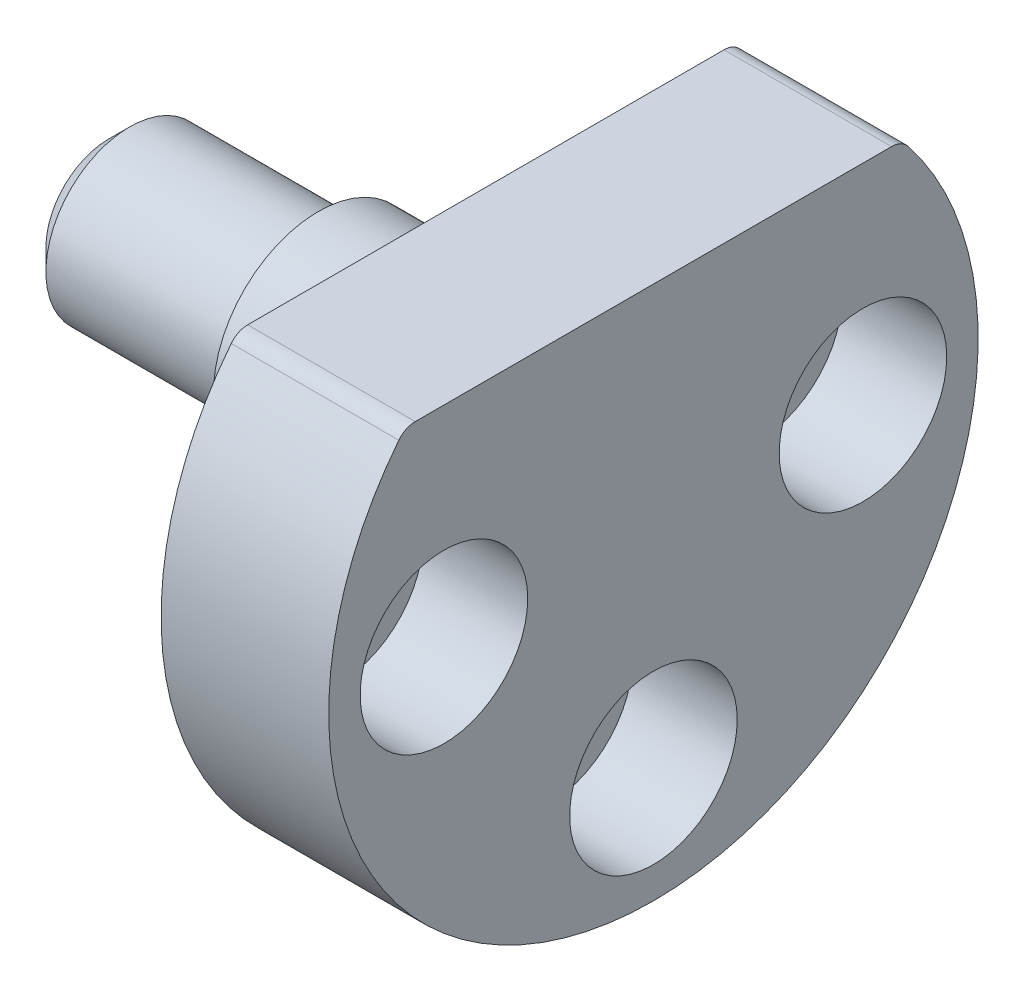
ISO-10303-21;
HEADER;
FILE_DESCRIPTION(('STEP AP214'),'2;1');
FILE_NAME('part.step','',(''),(''),'','','');
FILE_SCHEMA(('AUTOMOTIVE_DESIGN { 1 0 10303 214 1 1 1 1 }'));
ENDSEC;
DATA;
#1=APPLICATION_CONTEXT('core data for automotive mechanical design processes');
#2=APPLICATION_PROTOCOL_DEFINITION('international standard','automotive_design',2000,#1);
#3=PRODUCT_CONTEXT('',#1,'mechanical');
#4=PRODUCT('Part','Part','',(#3));
#5=PRODUCT_RELATED_PRODUCT_CATEGORY('part','',(#4));
#6=PRODUCT_DEFINITION_FORMATION('','',#4);
#7=PRODUCT_DEFINITION_CONTEXT('part definition',#1,'design');
#8=PRODUCT_DEFINITION('design','',#6,#7);
#9=PRODUCT_DEFINITION_SHAPE('','',#8);
#10=(LENGTH_UNIT() NAMED_UNIT(*) SI_UNIT(.MILLI.,.METRE.));
#11=(NAMED_UNIT(*) PLANE_ANGLE_UNIT() SI_UNIT($,.RADIAN.));
#12=(NAMED_UNIT(*) SI_UNIT($,.STERADIAN.) SOLID_ANGLE_UNIT());
#13=UNCERTAINTY_MEASURE_WITH_UNIT(LENGTH_MEASURE(1.E-05),#10,'distance_accuracy_value','');
#14=(GEOMETRIC_REPRESENTATION_CONTEXT(3) GLOBAL_UNCERTAINTY_ASSIGNED_CONTEXT((#13)) GLOBAL_UNIT_ASSIGNED_CONTEXT((#10,
#11,#12)) REPRESENTATION_CONTEXT('',''));
#15=CARTESIAN_POINT('',(0.,0.,0.));
#16=DIRECTION('',(0.,0.,1.));
#17=DIRECTION('',(1.,0.,0.));
#18=AXIS2_PLACEMENT_3D('',#15,#16,#17);
#19=CARTESIAN_POINT('',(4.,-5.,0.));
#20=DIRECTION('',(-1.,0.,0.));
#21=DIRECTION('',(0.,0.,1.));
#22=AXIS2_PLACEMENT_3D('',#19,#20,#21);
#23=CYLINDRICAL_SURFACE('',#22,1.);
#24=CARTESIAN_POINT('',(0.,-5.,0.));
#25=DIRECTION('',(1.,0.,0.));
#26=DIRECTION('',(0.,0.,-1.));
#27=AXIS2_PLACEMENT_3D('',#24,#25,#26);
#28=CIRCLE('',#27,1.);
#29=CARTESIAN_POINT('',(0.,-5.,-1.));
#30=VERTEX_POINT('',#29);
#31=EDGE_CURVE('E140',#30,#30,#28,.T.);
#32=ORIENTED_EDGE('',*,*,#31,.F.);
#33=EDGE_LOOP('',(#32));
#34=FACE_BOUND('',#33,.T.);
#35=CARTESIAN_POINT('',(1.5,-5.,0.));
#36=DIRECTION('',(1.,0.,0.));
#37=DIRECTION('',(0.,0.,-1.));
#38=AXIS2_PLACEMENT_3D('',#35,#36,#37);
#39=CIRCLE('',#38,1.);
#40=CARTESIAN_POINT('',(1.5,-5.,-1.));
#41=VERTEX_POINT('',#40);
#42=EDGE_CURVE('E39',#41,#41,#39,.T.);
#43=ORIENTED_EDGE('',*,*,#42,.T.);
#44=EDGE_LOOP('',(#43));
#45=FACE_BOUND('',#44,.T.);
#46=ADVANCED_FACE('F35',(#34,#45),#23,.F.);
#47=CARTESIAN_POINT('',(4.,0.,-5.));
#48=DIRECTION('',(-1.,0.,0.));
#49=DIRECTION('',(0.,0.,1.));
#50=AXIS2_PLACEMENT_3D('',#47,#48,#49);
#51=CYLINDRICAL_SURFACE('',#50,1.);
#52=CARTESIAN_POINT('',(0.,0.,-5.));
#53=DIRECTION('',(1.,0.,0.));
#54=DIRECTION('',(0.,0.,-1.));
#55=AXIS2_PLACEMENT_3D('',#52,#53,#54);
#56=CIRCLE('',#55,1.);
#57=CARTESIAN_POINT('',(0.,0.,-6.));
#58=VERTEX_POINT('',#57);
#59=EDGE_CURVE('E143',#58,#58,#56,.T.);
#60=ORIENTED_EDGE('',*,*,#59,.F.);
#61=EDGE_LOOP('',(#60));
#62=FACE_BOUND('',#61,.T.);
#63=CARTESIAN_POINT('',(1.5,0.,-5.));
#64=DIRECTION('',(1.,0.,0.));
#65=DIRECTION('',(0.,0.,-1.));
#66=AXIS2_PLACEMENT_3D('',#63,#64,#65);
#67=CIRCLE('',#66,1.);
#68=CARTESIAN_POINT('',(1.5,0.,-6.));
#69=VERTEX_POINT('',#68);
#70=EDGE_CURVE('E113',#69,#69,#67,.T.);
#71=ORIENTED_EDGE('',*,*,#70,.T.);
#72=EDGE_LOOP('',(#71));
#73=FACE_BOUND('',#72,.T.);
#74=ADVANCED_FACE('F203',(#62,#73),#51,.F.);
#75=CARTESIAN_POINT('',(4.,0.,5.));
#76=DIRECTION('',(-1.,0.,0.));
#77=DIRECTION('',(0.,0.,1.));
#78=AXIS2_PLACEMENT_3D('',#75,#76,#77);
#79=CYLINDRICAL_SURFACE('',#78,1.);
#80=CARTESIAN_POINT('',(0.,0.,5.));
#81=DIRECTION('',(1.,0.,0.));
#82=DIRECTION('',(0.,0.,-1.));
#83=AXIS2_PLACEMENT_3D('',#80,#81,#82);
#84=CIRCLE('',#83,1.);
#85=CARTESIAN_POINT('',(0.,0.,4.));
#86=VERTEX_POINT('',#85);
#87=EDGE_CURVE('E96',#86,#86,#84,.T.);
#88=ORIENTED_EDGE('',*,*,#87,.F.);
#89=EDGE_LOOP('',(#88));
#90=FACE_BOUND('',#89,.T.);
#91=CARTESIAN_POINT('',(1.5,0.,5.));
#92=DIRECTION('',(1.,0.,0.));
#93=DIRECTION('',(0.,0.,-1.));
#94=AXIS2_PLACEMENT_3D('',#91,#92,#93);
#95=CIRCLE('',#94,1.);
#96=CARTESIAN_POINT('',(1.5,0.,4.));
#97=VERTEX_POINT('',#96);
#98=EDGE_CURVE('E111',#97,#97,#95,.T.);
#99=ORIENTED_EDGE('',*,*,#98,.T.);
#100=EDGE_LOOP('',(#99));
#101=FACE_BOUND('',#100,.T.);
#102=ADVANCED_FACE('F209',(#90,#101),#79,.F.);
#103=CARTESIAN_POINT('',(4.,5.,5.9213596411635));
#104=DIRECTION('',(0.,1.,0.));
#105=DIRECTION('',(0.,0.,1.));
#106=AXIS2_PLACEMENT_3D('',#103,#104,#105);
#107=PLANE('',#106);
#108=DIRECTION('',(0.,0.,-1.));
#109=VECTOR('',#108,1.);
#110=CARTESIAN_POINT('',(4.,5.,5.9213596411635));
#111=LINE('',#110,#109);
#112=CARTESIAN_POINT('',(4.,5.,5.68440850045103));
#113=VERTEX_POINT('',#112);
#114=CARTESIAN_POINT('',(4.,5.,-5.68440850045103));
#115=VERTEX_POINT('',#114);
#116=EDGE_CURVE('E135',#113,#115,#111,.T.);
#117=ORIENTED_EDGE('',*,*,#116,.T.);
#118=DIRECTION('',(1.,0.,0.));
#119=VECTOR('',#118,1.);
#120=CARTESIAN_POINT('',(0.,5.,-5.68440850045103));
#121=LINE('',#120,#119);
#122=CARTESIAN_POINT('',(0.,5.,-5.68440850045103));
#123=VERTEX_POINT('',#122);
#124=EDGE_CURVE('E88',#115,#123,#121,.F.);
#125=ORIENTED_EDGE('',*,*,#124,.T.);
#126=DIRECTION('',(0.,0.,-1.));
#127=VECTOR('',#126,1.);
#128=CARTESIAN_POINT('',(0.,5.,5.9213596411635));
#129=LINE('',#128,#127);
#130=CARTESIAN_POINT('',(0.,5.,5.68440850045103));
#131=VERTEX_POINT('',#130);
#132=EDGE_CURVE('E81',#131,#123,#129,.T.);
#133=ORIENTED_EDGE('',*,*,#132,.F.);
#134=DIRECTION('',(1.,0.,0.));
#135=VECTOR('',#134,1.);
#136=CARTESIAN_POINT('',(4.,5.,5.68440850045103));
#137=LINE('',#136,#135);
#138=EDGE_CURVE('E94',#131,#113,#137,.T.);
#139=ORIENTED_EDGE('',*,*,#138,.T.);
#140=EDGE_LOOP('',(#117,#125,#133,#139));
#141=FACE_BOUND('',#140,.T.);
#142=ADVANCED_FACE('F93',(#141),#107,.T.);
#143=CARTESIAN_POINT('',(4.,0.,0.));
#144=DIRECTION('',(-1.,0.,0.));
#145=DIRECTION('',(0.,0.,1.));
#146=AXIS2_PLACEMENT_3D('',#143,#144,#145);
#147=CYLINDRICAL_SURFACE('',#146,7.75);
#148=CARTESIAN_POINT('',(0.,0.,0.));
#149=DIRECTION('',(1.,0.,0.));
#150=DIRECTION('',(0.,0.,-1.));
#151=AXIS2_PLACEMENT_3D('',#148,#149,#150);
#152=CIRCLE('',#151,7.75);
#153=CARTESIAN_POINT('',(0.,4.81034482758621,6.07643667289593));
#154=VERTEX_POINT('',#153);
#155=CARTESIAN_POINT('',(0.,4.81034482758621,-6.07643667289593));
#156=VERTEX_POINT('',#155);
#157=EDGE_CURVE('E82',#154,#156,#152,.T.);
#158=ORIENTED_EDGE('',*,*,#157,.T.);
#159=DIRECTION('',(-1.,0.,0.));
#160=VECTOR('',#159,1.);
#161=CARTESIAN_POINT('',(4.,4.81034482758621,-6.07643667289593));
#162=LINE('',#161,#160);
#163=CARTESIAN_POINT('',(4.,4.81034482758621,-6.07643667289593));
#164=VERTEX_POINT('',#163);
#165=EDGE_CURVE('E52',#156,#164,#162,.F.);
#166=ORIENTED_EDGE('',*,*,#165,.T.);
#167=CARTESIAN_POINT('',(4.,0.,0.));
#168=DIRECTION('',(1.,0.,0.));
#169=DIRECTION('',(0.,0.,-1.));
#170=AXIS2_PLACEMENT_3D('',#167,#168,#169);
#171=CIRCLE('',#170,7.75);
#172=CARTESIAN_POINT('',(4.,4.81034482758621,6.07643667289593));
#173=VERTEX_POINT('',#172);
#174=EDGE_CURVE('E132',#173,#164,#171,.T.);
#175=ORIENTED_EDGE('',*,*,#174,.F.);
#176=DIRECTION('',(-1.,0.,0.));
#177=VECTOR('',#176,1.);
#178=CARTESIAN_POINT('',(4.,4.81034482758621,6.07643667289593));
#179=LINE('',#178,#177);
#180=EDGE_CURVE('E107',#173,#154,#179,.T.);
#181=ORIENTED_EDGE('',*,*,#180,.T.);
#182=EDGE_LOOP('',(#158,#166,#175,#181));
#183=FACE_BOUND('',#182,.T.);
#184=ADVANCED_FACE('F179',(#183),#147,.T.);
#185=CARTESIAN_POINT('',(4.,0.,0.));
#186=DIRECTION('',(1.,0.,0.));
#187=DIRECTION('',(0.,0.,-1.));
#188=AXIS2_PLACEMENT_3D('',#185,#186,#187);
#189=PLANE('',#188);
#190=CARTESIAN_POINT('',(4.,0.,5.));
#191=DIRECTION('',(1.,0.,0.));
#192=DIRECTION('',(0.,0.,-1.));
#193=AXIS2_PLACEMENT_3D('',#190,#191,#192);
#194=CIRCLE('',#193,2.);
#195=CARTESIAN_POINT('',(4.,0.,3.));
#196=VERTEX_POINT('',#195);
#197=EDGE_CURVE('E162',#196,#196,#194,.T.);
#198=ORIENTED_EDGE('',*,*,#197,.F.);
#199=EDGE_LOOP('',(#198));
#200=FACE_BOUND('',#199,.T.);
#201=CARTESIAN_POINT('',(4.,0.,-5.));
#202=DIRECTION('',(1.,0.,0.));
#203=DIRECTION('',(0.,0.,-1.));
#204=AXIS2_PLACEMENT_3D('',#201,#202,#203);
#205=CIRCLE('',#204,2.);
#206=CARTESIAN_POINT('',(4.,0.,-7.));
#207=VERTEX_POINT('',#206);
#208=EDGE_CURVE('E156',#207,#207,#205,.T.);
#209=ORIENTED_EDGE('',*,*,#208,.F.);
#210=EDGE_LOOP('',(#209));
#211=FACE_BOUND('',#210,.T.);
#212=CARTESIAN_POINT('',(4.,-5.,0.));
#213=DIRECTION('',(1.,0.,0.));
#214=DIRECTION('',(0.,0.,-1.));
#215=AXIS2_PLACEMENT_3D('',#212,#213,#214);
#216=CIRCLE('',#215,2.);
#217=CARTESIAN_POINT('',(4.,-5.,-2.));
#218=VERTEX_POINT('',#217);
#219=EDGE_CURVE('E150',#218,#218,#216,.T.);
#220=ORIENTED_EDGE('',*,*,#219,.F.);
#221=EDGE_LOOP('',(#220));
#222=FACE_BOUND('',#221,.T.);
#223=ORIENTED_EDGE('',*,*,#174,.T.);
#224=CARTESIAN_POINT('',(4.,4.5,-5.68440850045103));
#225=DIRECTION('',(1.,0.,0.));
#226=DIRECTION('',(0.,0.,-1.));
#227=AXIS2_PLACEMENT_3D('',#224,#225,#226);
#228=CIRCLE('',#227,0.5);
#229=EDGE_CURVE('E11',#164,#115,#228,.T.);
#230=ORIENTED_EDGE('',*,*,#229,.T.);
#231=ORIENTED_EDGE('',*,*,#116,.F.);
#232=CARTESIAN_POINT('',(4.,4.5,5.68440850045103));
#233=DIRECTION('',(1.,0.,0.));
#234=DIRECTION('',(0.,0.,-1.));
#235=AXIS2_PLACEMENT_3D('',#232,#233,#234);
#236=CIRCLE('',#235,0.5);
#237=EDGE_CURVE('E44',#113,#173,#236,.T.);
#238=ORIENTED_EDGE('',*,*,#237,.T.);
#239=EDGE_LOOP('',(#223,#230,#231,#238));
#240=FACE_BOUND('',#239,.T.);
#241=ADVANCED_FACE('F176',(#200,#211,#222,#240),#189,.T.);
#242=CARTESIAN_POINT('',(0.,0.,0.));
#243=DIRECTION('',(1.,0.,0.));
#244=DIRECTION('',(0.,0.,-1.));
#245=AXIS2_PLACEMENT_3D('',#242,#243,#244);
#246=PLANE('',#245);
#247=CARTESIAN_POINT('',(0.,0.,0.));
#248=DIRECTION('',(1.,0.,0.));
#249=DIRECTION('',(0.,0.,-1.));
#250=AXIS2_PLACEMENT_3D('',#247,#248,#249);
#251=CIRCLE('',#250,2.5);
#252=CARTESIAN_POINT('',(0.,0.,-2.5));
#253=VERTEX_POINT('',#252);
#254=EDGE_CURVE('E123',#253,#253,#251,.T.);
#255=ORIENTED_EDGE('',*,*,#254,.T.);
#256=EDGE_LOOP('',(#255));
#257=FACE_BOUND('',#256,.T.);
#258=ORIENTED_EDGE('',*,*,#87,.T.);
#259=EDGE_LOOP('',(#258));
#260=FACE_BOUND('',#259,.T.);
#261=ORIENTED_EDGE('',*,*,#59,.T.);
#262=EDGE_LOOP('',(#261));
#263=FACE_BOUND('',#262,.T.);
#264=ORIENTED_EDGE('',*,*,#31,.T.);
#265=EDGE_LOOP('',(#264));
#266=FACE_BOUND('',#265,.T.);
#267=ORIENTED_EDGE('',*,*,#132,.T.);
#268=CARTESIAN_POINT('',(0.,4.5,-5.68440850045103));
#269=DIRECTION('',(1.,0.,0.));
#270=DIRECTION('',(0.,0.,-1.));
#271=AXIS2_PLACEMENT_3D('',#268,#269,#270);
#272=CIRCLE('',#271,0.5);
#273=EDGE_CURVE('E87',#123,#156,#272,.F.);
#274=ORIENTED_EDGE('',*,*,#273,.T.);
#275=ORIENTED_EDGE('',*,*,#157,.F.);
#276=CARTESIAN_POINT('',(0.,4.5,5.68440850045103));
#277=DIRECTION('',(1.,0.,0.));
#278=DIRECTION('',(0.,0.,-1.));
#279=AXIS2_PLACEMENT_3D('',#276,#277,#278);
#280=CIRCLE('',#279,0.5);
#281=EDGE_CURVE('E78',#154,#131,#280,.F.);
#282=ORIENTED_EDGE('',*,*,#281,.T.);
#283=EDGE_LOOP('',(#267,#274,#275,#282));
#284=FACE_BOUND('',#283,.T.);
#285=ADVANCED_FACE('F80',(#257,#260,#263,#266,#284),#246,.F.);
#286=CARTESIAN_POINT('',(-4.,0.,0.));
#287=DIRECTION('',(1.,0.,0.));
#288=DIRECTION('',(0.,0.,-1.));
#289=AXIS2_PLACEMENT_3D('',#286,#287,#288);
#290=CYLINDRICAL_SURFACE('',#289,2.5);
#291=CARTESIAN_POINT('',(-4.,0.,0.));
#292=DIRECTION('',(1.,0.,0.));
#293=DIRECTION('',(0.,0.,-1.));
#294=AXIS2_PLACEMENT_3D('',#291,#292,#293);
#295=CIRCLE('',#294,2.5);
#296=CARTESIAN_POINT('',(-4.,0.,-2.5));
#297=VERTEX_POINT('',#296);
#298=EDGE_CURVE('E128',#297,#297,#295,.T.);
#299=ORIENTED_EDGE('',*,*,#298,.T.);
#300=EDGE_LOOP('',(#299));
#301=FACE_BOUND('',#300,.T.);
#302=ORIENTED_EDGE('',*,*,#254,.F.);
#303=EDGE_LOOP('',(#302));
#304=FACE_BOUND('',#303,.T.);
#305=ADVANCED_FACE('F217',(#301,#304),#290,.T.);
#306=CARTESIAN_POINT('',(-4.,0.,0.));
#307=DIRECTION('',(1.,0.,0.));
#308=DIRECTION('',(0.,0.,-1.));
#309=AXIS2_PLACEMENT_3D('',#306,#307,#308);
#310=PLANE('',#309);
#311=CARTESIAN_POINT('',(-4.,0.,0.));
#312=DIRECTION('',(1.,0.,0.));
#313=DIRECTION('',(0.,0.,-1.));
#314=AXIS2_PLACEMENT_3D('',#311,#312,#313);
#315=CIRCLE('',#314,2.);
#316=CARTESIAN_POINT('',(-4.,0.,-2.));
#317=VERTEX_POINT('',#316);
#318=EDGE_CURVE('E119',#317,#317,#315,.T.);
#319=ORIENTED_EDGE('',*,*,#318,.T.);
#320=EDGE_LOOP('',(#319));
#321=FACE_BOUND('',#320,.T.);
#322=ORIENTED_EDGE('',*,*,#298,.F.);
#323=EDGE_LOOP('',(#322));
#324=FACE_BOUND('',#323,.T.);
#325=ADVANCED_FACE('F324',(#321,#324),#310,.F.);
#326=CARTESIAN_POINT('',(-9.,0.,0.));
#327=DIRECTION('',(1.,0.,0.));
#328=DIRECTION('',(0.,0.,-1.));
#329=AXIS2_PLACEMENT_3D('',#326,#327,#328);
#330=CYLINDRICAL_SURFACE('',#329,2.);
#331=CARTESIAN_POINT('',(-8.49999999999999,0.,0.));
#332=DIRECTION('',(1.,0.,0.));
#333=DIRECTION('',(0.,0.,-1.));
#334=AXIS2_PLACEMENT_3D('',#331,#332,#333);
#335=CIRCLE('',#334,2.);
#336=CARTESIAN_POINT('',(-8.49999999999999,0.,-2.));
#337=VERTEX_POINT('',#336);
#338=EDGE_CURVE('E102',#337,#337,#335,.T.);
#339=ORIENTED_EDGE('',*,*,#338,.T.);
#340=EDGE_LOOP('',(#339));
#341=FACE_BOUND('',#340,.T.);
#342=ORIENTED_EDGE('',*,*,#318,.F.);
#343=EDGE_LOOP('',(#342));
#344=FACE_BOUND('',#343,.T.);
#345=ADVANCED_FACE('F316',(#341,#344),#330,.T.);
#346=CARTESIAN_POINT('',(-9.,0.,0.));
#347=DIRECTION('',(1.,0.,0.));
#348=DIRECTION('',(0.,0.,-1.));
#349=AXIS2_PLACEMENT_3D('',#346,#347,#348);
#350=PLANE('',#349);
#351=CARTESIAN_POINT('',(-9.,0.,0.));
#352=DIRECTION('',(1.,0.,0.));
#353=DIRECTION('',(0.,0.,-1.));
#354=AXIS2_PLACEMENT_3D('',#351,#352,#353);
#355=CIRCLE('',#354,1.49999999999999);
#356=CARTESIAN_POINT('',(-9.,0.,-1.49999999999999));
#357=VERTEX_POINT('',#356);
#358=EDGE_CURVE('E98',#357,#357,#355,.F.);
#359=ORIENTED_EDGE('',*,*,#358,.T.);
#360=EDGE_LOOP('',(#359));
#361=FACE_BOUND('',#360,.T.);
#362=ADVANCED_FACE('F229',(#361),#350,.F.);
#363=CARTESIAN_POINT('',(-8.49999999999999,0.,0.));
#364=DIRECTION('',(1.,0.,0.));
#365=DIRECTION('',(0.,0.,-1.));
#366=AXIS2_PLACEMENT_3D('',#363,#364,#365);
#367=CONICAL_SURFACE('',#366,2.,0.785398163397453);
#368=ORIENTED_EDGE('',*,*,#358,.F.);
#369=EDGE_LOOP('',(#368));
#370=FACE_BOUND('',#369,.T.);
#371=ORIENTED_EDGE('',*,*,#338,.F.);
#372=EDGE_LOOP('',(#371));
#373=FACE_BOUND('',#372,.T.);
#374=ADVANCED_FACE('F224',(#370,#373),#367,.T.);
#375=CARTESIAN_POINT('',(4.,4.5,-5.68440850045103));
#376=DIRECTION('',(-1.,0.,0.));
#377=DIRECTION('',(0.,0.,1.));
#378=AXIS2_PLACEMENT_3D('',#375,#376,#377);
#379=CYLINDRICAL_SURFACE('',#378,0.5);
#380=ORIENTED_EDGE('',*,*,#229,.F.);
#381=ORIENTED_EDGE('',*,*,#165,.F.);
#382=ORIENTED_EDGE('',*,*,#273,.F.);
#383=ORIENTED_EDGE('',*,*,#124,.F.);
#384=EDGE_LOOP('',(#380,#381,#382,#383));
#385=FACE_BOUND('',#384,.T.);
#386=ADVANCED_FACE('F228',(#385),#379,.T.);
#387=CARTESIAN_POINT('',(4.,4.5,5.68440850045103));
#388=DIRECTION('',(-1.,0.,0.));
#389=DIRECTION('',(0.,0.,1.));
#390=AXIS2_PLACEMENT_3D('',#387,#388,#389);
#391=CYLINDRICAL_SURFACE('',#390,0.5);
#392=ORIENTED_EDGE('',*,*,#237,.F.);
#393=ORIENTED_EDGE('',*,*,#138,.F.);
#394=ORIENTED_EDGE('',*,*,#281,.F.);
#395=ORIENTED_EDGE('',*,*,#180,.F.);
#396=EDGE_LOOP('',(#392,#393,#394,#395));
#397=FACE_BOUND('',#396,.T.);
#398=ADVANCED_FACE('F37',(#397),#391,.T.);
#399=CARTESIAN_POINT('',(1.5,0.,5.));
#400=DIRECTION('',(1.,0.,0.));
#401=DIRECTION('',(0.,0.,-1.));
#402=AXIS2_PLACEMENT_3D('',#399,#400,#401);
#403=CYLINDRICAL_SURFACE('',#402,2.);
#404=CARTESIAN_POINT('',(1.5,0.,5.));
#405=DIRECTION('',(1.,0.,0.));
#406=DIRECTION('',(0.,0.,-1.));
#407=AXIS2_PLACEMENT_3D('',#404,#405,#406);
#408=CIRCLE('',#407,2.);
#409=CARTESIAN_POINT('',(1.5,0.,3.));
#410=VERTEX_POINT('',#409);
#411=EDGE_CURVE('E114',#410,#410,#408,.T.);
#412=ORIENTED_EDGE('',*,*,#411,.F.);
#413=EDGE_LOOP('',(#412));
#414=FACE_BOUND('',#413,.T.);
#415=ORIENTED_EDGE('',*,*,#197,.T.);
#416=EDGE_LOOP('',(#415));
#417=FACE_BOUND('',#416,.T.);
#418=ADVANCED_FACE('F170',(#414,#417),#403,.F.);
#419=CARTESIAN_POINT('',(1.5,0.,5.));
#420=DIRECTION('',(1.,0.,0.));
#421=DIRECTION('',(0.,0.,-1.));
#422=AXIS2_PLACEMENT_3D('',#419,#420,#421);
#423=PLANE('',#422);
#424=ORIENTED_EDGE('',*,*,#98,.F.);
#425=EDGE_LOOP('',(#424));
#426=FACE_BOUND('',#425,.T.);
#427=ORIENTED_EDGE('',*,*,#411,.T.);
#428=EDGE_LOOP('',(#427));
#429=FACE_BOUND('',#428,.T.);
#430=ADVANCED_FACE('F168',(#426,#429),#423,.T.);
#431=CARTESIAN_POINT('',(1.5,0.,-5.));
#432=DIRECTION('',(1.,0.,0.));
#433=DIRECTION('',(0.,0.,-1.));
#434=AXIS2_PLACEMENT_3D('',#431,#432,#433);
#435=CYLINDRICAL_SURFACE('',#434,2.);
#436=CARTESIAN_POINT('',(1.5,0.,-5.));
#437=DIRECTION('',(1.,0.,0.));
#438=DIRECTION('',(0.,0.,-1.));
#439=AXIS2_PLACEMENT_3D('',#436,#437,#438);
#440=CIRCLE('',#439,2.);
#441=CARTESIAN_POINT('',(1.5,0.,-7.));
#442=VERTEX_POINT('',#441);
#443=EDGE_CURVE('E159',#442,#442,#440,.T.);
#444=ORIENTED_EDGE('',*,*,#443,.F.);
#445=EDGE_LOOP('',(#444));
#446=FACE_BOUND('',#445,.T.);
#447=ORIENTED_EDGE('',*,*,#208,.T.);
#448=EDGE_LOOP('',(#447));
#449=FACE_BOUND('',#448,.T.);
#450=ADVANCED_FACE('F197',(#446,#449),#435,.F.);
#451=CARTESIAN_POINT('',(1.5,0.,-5.));
#452=DIRECTION('',(1.,0.,0.));
#453=DIRECTION('',(0.,0.,-1.));
#454=AXIS2_PLACEMENT_3D('',#451,#452,#453);
#455=PLANE('',#454);
#456=ORIENTED_EDGE('',*,*,#70,.F.);
#457=EDGE_LOOP('',(#456));
#458=FACE_BOUND('',#457,.T.);
#459=ORIENTED_EDGE('',*,*,#443,.T.);
#460=EDGE_LOOP('',(#459));
#461=FACE_BOUND('',#460,.T.);
#462=ADVANCED_FACE('F188',(#458,#461),#455,.T.);
#463=CARTESIAN_POINT('',(1.5,-5.,0.));
#464=DIRECTION('',(1.,0.,0.));
#465=DIRECTION('',(0.,0.,-1.));
#466=AXIS2_PLACEMENT_3D('',#463,#464,#465);
#467=CYLINDRICAL_SURFACE('',#466,2.);
#468=CARTESIAN_POINT('',(1.5,-5.,0.));
#469=DIRECTION('',(1.,0.,0.));
#470=DIRECTION('',(0.,0.,-1.));
#471=AXIS2_PLACEMENT_3D('',#468,#469,#470);
#472=CIRCLE('',#471,2.);
#473=CARTESIAN_POINT('',(1.5,-5.,-2.));
#474=VERTEX_POINT('',#473);
#475=EDGE_CURVE('E153',#474,#474,#472,.T.);
#476=ORIENTED_EDGE('',*,*,#475,.F.);
#477=EDGE_LOOP('',(#476));
#478=FACE_BOUND('',#477,.T.);
#479=ORIENTED_EDGE('',*,*,#219,.T.);
#480=EDGE_LOOP('',(#479));
#481=FACE_BOUND('',#480,.T.);
#482=ADVANCED_FACE('F185',(#478,#481),#467,.F.);
#483=CARTESIAN_POINT('',(1.5,-5.,0.));
#484=DIRECTION('',(1.,0.,0.));
#485=DIRECTION('',(0.,0.,-1.));
#486=AXIS2_PLACEMENT_3D('',#483,#484,#485);
#487=PLANE('',#486);
#488=ORIENTED_EDGE('',*,*,#42,.F.);
#489=EDGE_LOOP('',(#488));
#490=FACE_BOUND('',#489,.T.);
#491=ORIENTED_EDGE('',*,*,#475,.T.);
#492=EDGE_LOOP('',(#491));
#493=FACE_BOUND('',#492,.T.);
#494=ADVANCED_FACE('F187',(#490,#493),#487,.T.);
#495=CLOSED_SHELL('',(#46,#74,#102,#142,#184,#241,#285,#305,#325,#345,#362,#374,#386,#398,#418,
#430,#450,#462,#482,#494));
#496=MANIFOLD_SOLID_BREP('B2',#495);
#497=ADVANCED_BREP_SHAPE_REPRESENTATION('',(#18,#496),#14);
#498=SHAPE_DEFINITION_REPRESENTATION(#9,#497);
ENDSEC;
END-ISO-10303-21;
